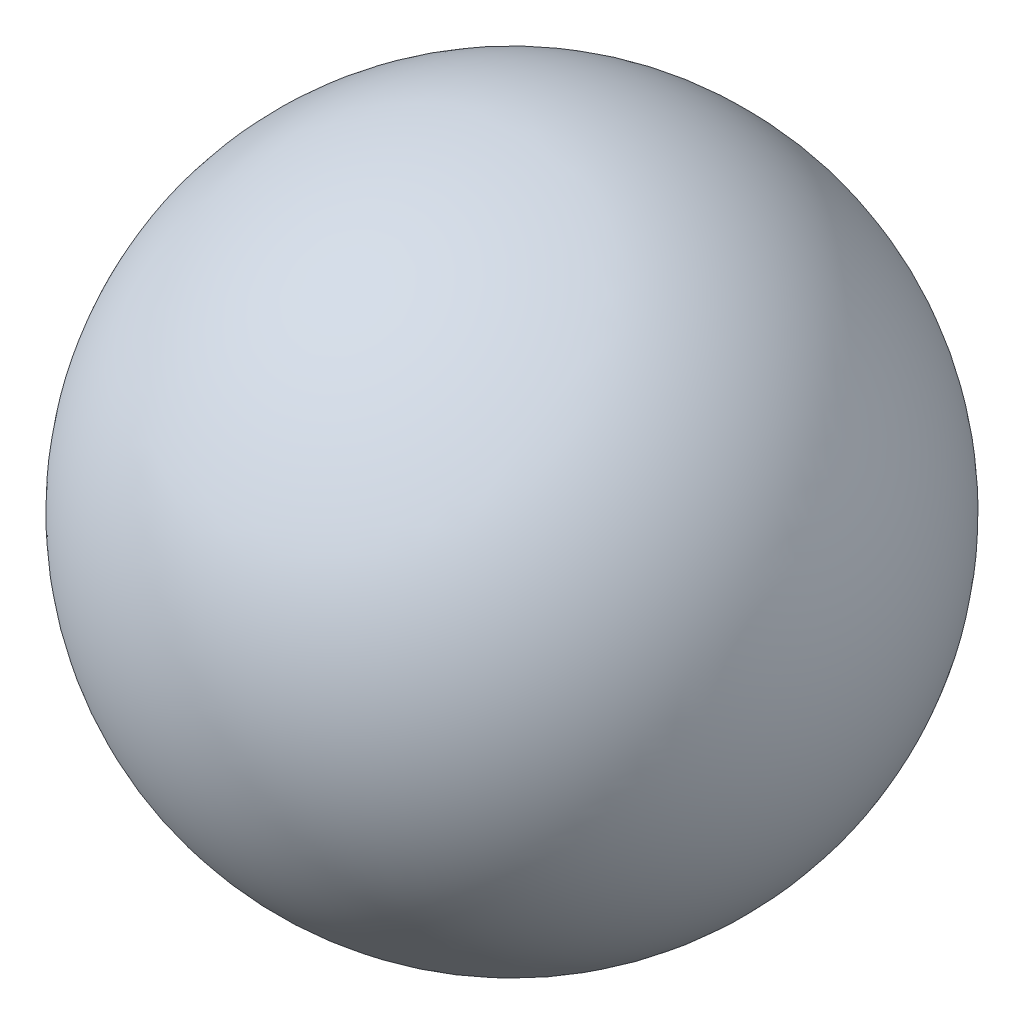
ISO-10303-21;
HEADER;
FILE_DESCRIPTION(('STEP AP214'),'2;1');
FILE_NAME('part.step','',(''),(''),'','','');
FILE_SCHEMA(('AUTOMOTIVE_DESIGN { 1 0 10303 214 1 1 1 1 }'));
ENDSEC;
DATA;
#1=APPLICATION_CONTEXT('core data for automotive mechanical design processes');
#2=APPLICATION_PROTOCOL_DEFINITION('international standard','automotive_design',2000,#1);
#3=PRODUCT_CONTEXT('',#1,'mechanical');
#4=PRODUCT('Part','Part','',(#3));
#5=PRODUCT_RELATED_PRODUCT_CATEGORY('part','',(#4));
#6=PRODUCT_DEFINITION_FORMATION('','',#4);
#7=PRODUCT_DEFINITION_CONTEXT('part definition',#1,'design');
#8=PRODUCT_DEFINITION('design','',#6,#7);
#9=PRODUCT_DEFINITION_SHAPE('','',#8);
#10=(LENGTH_UNIT() NAMED_UNIT(*) SI_UNIT(.MILLI.,.METRE.));
#11=(NAMED_UNIT(*) PLANE_ANGLE_UNIT() SI_UNIT($,.RADIAN.));
#12=(NAMED_UNIT(*) SI_UNIT($,.STERADIAN.) SOLID_ANGLE_UNIT());
#13=UNCERTAINTY_MEASURE_WITH_UNIT(LENGTH_MEASURE(1.E-05),#10,'distance_accuracy_value','');
#14=(GEOMETRIC_REPRESENTATION_CONTEXT(3) GLOBAL_UNCERTAINTY_ASSIGNED_CONTEXT((#13)) GLOBAL_UNIT_ASSIGNED_CONTEXT((#10,
#11,#12)) REPRESENTATION_CONTEXT('',''));
#15=CARTESIAN_POINT('',(0.,0.,0.));
#16=DIRECTION('',(0.,0.,1.));
#17=DIRECTION('',(1.,0.,0.));
#18=AXIS2_PLACEMENT_3D('',#15,#16,#17);
#19=CARTESIAN_POINT('',(0.,0.,0.));
#20=DIRECTION('',(-1.,0.,0.));
#21=DIRECTION('',(0.,1.,0.));
#22=AXIS2_PLACEMENT_3D('',#19,#20,#21);
#23=SPHERICAL_SURFACE('',#22,20.75);
#24=CARTESIAN_POINT('',(-20.75,0.,0.));
#25=VERTEX_POINT('',#24);
#26=VERTEX_LOOP('',#25);
#27=FACE_BOUND('',#26,.T.);
#28=ADVANCED_FACE('F33',(#27),#23,.T.);
#29=CLOSED_SHELL('',(#28));
#30=MANIFOLD_SOLID_BREP('B2',#29);
#31=ADVANCED_BREP_SHAPE_REPRESENTATION('',(#18,#30),#14);
#32=SHAPE_DEFINITION_REPRESENTATION(#9,#31);
ENDSEC;
END-ISO-10303-21;
